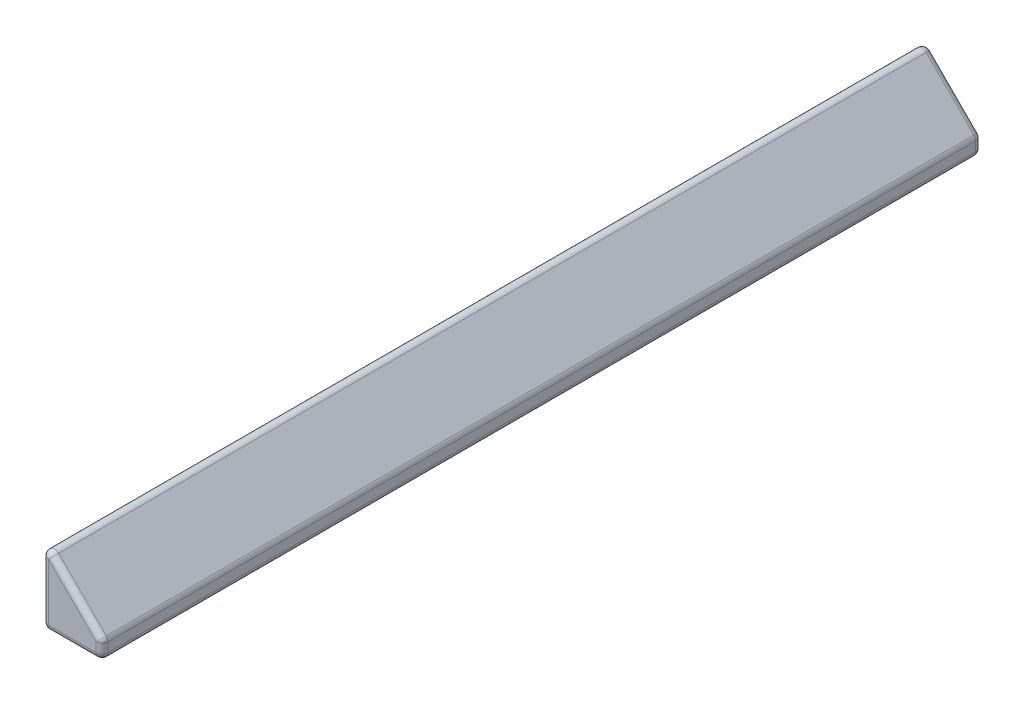
ISO-10303-21;
HEADER;
FILE_DESCRIPTION(('STEP AP214'),'2;1');
FILE_NAME('part.step','',(''),(''),'','','');
FILE_SCHEMA(('AUTOMOTIVE_DESIGN { 1 0 10303 214 1 1 1 1 }'));
ENDSEC;
DATA;
#1=APPLICATION_CONTEXT('core data for automotive mechanical design processes');
#2=APPLICATION_PROTOCOL_DEFINITION('international standard','automotive_design',2000,#1);
#3=PRODUCT_CONTEXT('',#1,'mechanical');
#4=PRODUCT('Part','Part','',(#3));
#5=PRODUCT_RELATED_PRODUCT_CATEGORY('part','',(#4));
#6=PRODUCT_DEFINITION_FORMATION('','',#4);
#7=PRODUCT_DEFINITION_CONTEXT('part definition',#1,'design');
#8=PRODUCT_DEFINITION('design','',#6,#7);
#9=PRODUCT_DEFINITION_SHAPE('','',#8);
#10=(LENGTH_UNIT() NAMED_UNIT(*) SI_UNIT(.MILLI.,.METRE.));
#11=(NAMED_UNIT(*) PLANE_ANGLE_UNIT() SI_UNIT($,.RADIAN.));
#12=(NAMED_UNIT(*) SI_UNIT($,.STERADIAN.) SOLID_ANGLE_UNIT());
#13=UNCERTAINTY_MEASURE_WITH_UNIT(LENGTH_MEASURE(1.E-05),#10,'distance_accuracy_value','');
#14=(GEOMETRIC_REPRESENTATION_CONTEXT(3) GLOBAL_UNCERTAINTY_ASSIGNED_CONTEXT((#13)) GLOBAL_UNIT_ASSIGNED_CONTEXT((#10,
#11,#12)) REPRESENTATION_CONTEXT('',''));
#15=CARTESIAN_POINT('',(0.,0.,0.));
#16=DIRECTION('',(0.,0.,1.));
#17=DIRECTION('',(1.,0.,0.));
#18=AXIS2_PLACEMENT_3D('',#15,#16,#17);
#19=CARTESIAN_POINT('',(224.999999999994,-3.00000000001998,-13.1842131029184));
#20=DIRECTION('',(0.,0.,-1.));
#21=DIRECTION('',(-1.,0.,0.));
#22=AXIS2_PLACEMENT_3D('',#19,#20,#21);
#23=PLANE('',#22);
#24=DIRECTION('',(-0.707106781186546,0.707106781186549,0.));
#25=VECTOR('',#24,1.);
#26=CARTESIAN_POINT('',(225.158578643756,-2.8414213562579,-13.1842131029184));
#27=LINE('',#26,#25);
#28=CARTESIAN_POINT('',(220.199999999993,2.1171572875046,-13.1842131029184));
#29=VERTEX_POINT('',#28);
#30=CARTESIAN_POINT('',(221.799999999993,0.517157287504608,-13.1842131029184));
#31=VERTEX_POINT('',#30);
#32=EDGE_CURVE('E263',#29,#31,#27,.F.);
#33=ORIENTED_EDGE('',*,*,#32,.T.);
#34=DIRECTION('',(0.,1.,0.));
#35=VECTOR('',#34,1.);
#36=CARTESIAN_POINT('',(221.799999999993,-3.00000000001998,-13.1842131029184));
#37=LINE('',#36,#35);
#38=CARTESIAN_POINT('',(221.799999999993,0.199999999979239,-13.1842131029184));
#39=VERTEX_POINT('',#38);
#40=EDGE_CURVE('E261',#31,#39,#37,.F.);
#41=ORIENTED_EDGE('',*,*,#40,.T.);
#42=DIRECTION('',(1.,0.,0.));
#43=VECTOR('',#42,1.);
#44=CARTESIAN_POINT('',(224.999999999994,0.199999999979265,-13.1842131029184));
#45=LINE('',#44,#43);
#46=CARTESIAN_POINT('',(220.199999999993,0.199999999979227,-13.1842131029184));
#47=VERTEX_POINT('',#46);
#48=EDGE_CURVE('E253',#39,#47,#45,.F.);
#49=ORIENTED_EDGE('',*,*,#48,.T.);
#50=DIRECTION('',(0.,-1.,0.));
#51=VECTOR('',#50,1.);
#52=CARTESIAN_POINT('',(220.199999999993,-3.00000000001998,-13.1842131029184));
#53=LINE('',#52,#51);
#54=EDGE_CURVE('E258',#47,#29,#53,.F.);
#55=ORIENTED_EDGE('',*,*,#54,.T.);
#56=EDGE_LOOP('',(#33,#41,#49,#55));
#57=FACE_BOUND('',#56,.T.);
#58=ADVANCED_FACE('F35',(#57),#23,.T.);
#59=CARTESIAN_POINT('',(221.999999999993,0.,-16.4644569962897));
#60=DIRECTION('',(1.,0.,0.));
#61=DIRECTION('',(0.,0.,-1.));
#62=AXIS2_PLACEMENT_3D('',#59,#60,#61);
#63=PLANE('',#62);
#64=DIRECTION('',(0.,0.,1.));
#65=VECTOR('',#64,1.);
#66=CARTESIAN_POINT('',(221.999999999993,0.199999999979239,-16.4644569962897));
#67=LINE('',#66,#65);
#68=CARTESIAN_POINT('',(221.999999999993,0.199999999979239,16.1157868970816));
#69=VERTEX_POINT('',#68);
#70=CARTESIAN_POINT('',(221.999999999993,0.199999999979239,-12.9842131029184));
#71=VERTEX_POINT('',#70);
#72=EDGE_CURVE('E133',#69,#71,#67,.F.);
#73=ORIENTED_EDGE('',*,*,#72,.T.);
#74=DIRECTION('',(0.,1.,0.));
#75=VECTOR('',#74,1.);
#76=CARTESIAN_POINT('',(221.999999999993,0.,-12.9842131029184));
#77=LINE('',#76,#75);
#78=CARTESIAN_POINT('',(221.999999999993,0.51715728750461,-12.9842131029184));
#79=VERTEX_POINT('',#78);
#80=EDGE_CURVE('E129',#71,#79,#77,.T.);
#81=ORIENTED_EDGE('',*,*,#80,.T.);
#82=DIRECTION('',(0.,0.,1.));
#83=VECTOR('',#82,1.);
#84=CARTESIAN_POINT('',(221.999999999993,0.51715728750461,-16.4644569962897));
#85=LINE('',#84,#83);
#86=CARTESIAN_POINT('',(221.999999999993,0.51715728750461,16.1157868970816));
#87=VERTEX_POINT('',#86);
#88=EDGE_CURVE('E123',#79,#87,#85,.T.);
#89=ORIENTED_EDGE('',*,*,#88,.T.);
#90=DIRECTION('',(0.,1.,0.));
#91=VECTOR('',#90,1.);
#92=CARTESIAN_POINT('',(221.999999999993,0.,16.1157868970816));
#93=LINE('',#92,#91);
#94=EDGE_CURVE('E126',#87,#69,#93,.F.);
#95=ORIENTED_EDGE('',*,*,#94,.T.);
#96=EDGE_LOOP('',(#73,#81,#89,#95));
#97=FACE_BOUND('',#96,.T.);
#98=ADVANCED_FACE('F125',(#97),#63,.T.);
#99=CARTESIAN_POINT('',(111.299999999987,111.299999999986,-16.4644569962897));
#100=DIRECTION('',(0.707106781186549,0.707106781186546,0.));
#101=DIRECTION('',(-0.707106781186546,0.707106781186549,0.));
#102=AXIS2_PLACEMENT_3D('',#99,#100,#101);
#103=PLANE('',#102);
#104=DIRECTION('',(0.,0.,1.));
#105=VECTOR('',#104,1.);
#106=CARTESIAN_POINT('',(221.941421356231,0.658578643741928,-16.4644569962897));
#107=LINE('',#106,#105);
#108=CARTESIAN_POINT('',(221.941421356231,0.658578643741911,16.1157868970816));
#109=VERTEX_POINT('',#108);
#110=CARTESIAN_POINT('',(221.941421356231,0.658578643741915,-12.9842131029184));
#111=VERTEX_POINT('',#110);
#112=EDGE_CURVE('E154',#109,#111,#107,.F.);
#113=ORIENTED_EDGE('',*,*,#112,.T.);
#114=DIRECTION('',(-0.707106781186546,0.707106781186549,0.));
#115=VECTOR('',#114,1.);
#116=CARTESIAN_POINT('',(111.299999999987,111.299999999986,-12.9842131029183));
#117=LINE('',#116,#115);
#118=CARTESIAN_POINT('',(220.341421356231,2.25857864374191,-12.9842131029184));
#119=VERTEX_POINT('',#118);
#120=EDGE_CURVE('E276',#111,#119,#117,.T.);
#121=ORIENTED_EDGE('',*,*,#120,.T.);
#122=DIRECTION('',(0.,0.,1.));
#123=VECTOR('',#122,1.);
#124=CARTESIAN_POINT('',(220.341421356231,2.2585786437419,-16.4644569962897));
#125=LINE('',#124,#123);
#126=CARTESIAN_POINT('',(220.341421356231,2.25857864374191,16.1157868970816));
#127=VERTEX_POINT('',#126);
#128=EDGE_CURVE('E269',#119,#127,#125,.T.);
#129=ORIENTED_EDGE('',*,*,#128,.T.);
#130=DIRECTION('',(-0.707106781186546,0.707106781186549,0.));
#131=VECTOR('',#130,1.);
#132=CARTESIAN_POINT('',(111.299999999987,111.299999999986,16.1157868970817));
#133=LINE('',#132,#131);
#134=EDGE_CURVE('E267',#127,#109,#133,.F.);
#135=ORIENTED_EDGE('',*,*,#134,.T.);
#136=EDGE_LOOP('',(#113,#121,#129,#135));
#137=FACE_BOUND('',#136,.T.);
#138=ADVANCED_FACE('F336',(#137),#103,.T.);
#139=CARTESIAN_POINT('',(219.999999999993,0.,-16.4644569962897));
#140=DIRECTION('',(-1.,0.,0.));
#141=DIRECTION('',(0.,0.,1.));
#142=AXIS2_PLACEMENT_3D('',#139,#140,#141);
#143=PLANE('',#142);
#144=DIRECTION('',(0.,0.,1.));
#145=VECTOR('',#144,1.);
#146=CARTESIAN_POINT('',(219.999999999993,2.1171572875046,-16.4644569962897));
#147=LINE('',#146,#145);
#148=CARTESIAN_POINT('',(219.999999999993,2.1171572875046,16.1157868970816));
#149=VERTEX_POINT('',#148);
#150=CARTESIAN_POINT('',(219.999999999993,2.1171572875046,-12.9842131029184));
#151=VERTEX_POINT('',#150);
#152=EDGE_CURVE('E282',#149,#151,#147,.F.);
#153=ORIENTED_EDGE('',*,*,#152,.T.);
#154=DIRECTION('',(0.,-1.,0.));
#155=VECTOR('',#154,1.);
#156=CARTESIAN_POINT('',(219.999999999993,0.,-12.9842131029184));
#157=LINE('',#156,#155);
#158=CARTESIAN_POINT('',(219.999999999993,0.199999999979227,-12.9842131029184));
#159=VERTEX_POINT('',#158);
#160=EDGE_CURVE('E222',#151,#159,#157,.T.);
#161=ORIENTED_EDGE('',*,*,#160,.T.);
#162=DIRECTION('',(0.,0.,1.));
#163=VECTOR('',#162,1.);
#164=CARTESIAN_POINT('',(219.999999999993,0.199999999979227,-16.4644569962897));
#165=LINE('',#164,#163);
#166=CARTESIAN_POINT('',(219.999999999993,0.199999999979227,16.1157868970816));
#167=VERTEX_POINT('',#166);
#168=EDGE_CURVE('E212',#159,#167,#165,.T.);
#169=ORIENTED_EDGE('',*,*,#168,.T.);
#170=DIRECTION('',(0.,-1.,0.));
#171=VECTOR('',#170,1.);
#172=CARTESIAN_POINT('',(219.999999999993,0.,16.1157868970816));
#173=LINE('',#172,#171);
#174=EDGE_CURVE('E279',#167,#149,#173,.F.);
#175=ORIENTED_EDGE('',*,*,#174,.T.);
#176=EDGE_LOOP('',(#153,#161,#169,#175));
#177=FACE_BOUND('',#176,.T.);
#178=ADVANCED_FACE('F285',(#177),#143,.T.);
#179=CARTESIAN_POINT('',(0.,-2.25364598777516E-11,-16.4644569962897));
#180=DIRECTION('',(0.,-1.,0.));
#181=DIRECTION('',(1.,0.,0.));
#182=AXIS2_PLACEMENT_3D('',#179,#180,#181);
#183=PLANE('',#182);
#184=DIRECTION('',(1.,0.,0.));
#185=VECTOR('',#184,1.);
#186=CARTESIAN_POINT('',(0.,-2.25364598777516E-11,-12.9842131029183));
#187=LINE('',#186,#185);
#188=CARTESIAN_POINT('',(220.199999999993,-2.07734470650896E-11,-12.9842131029184));
#189=VERTEX_POINT('',#188);
#190=CARTESIAN_POINT('',(221.799999999993,-2.07606367994209E-11,-12.9842131029184));
#191=VERTEX_POINT('',#190);
#192=EDGE_CURVE('E217',#189,#191,#187,.T.);
#193=ORIENTED_EDGE('',*,*,#192,.T.);
#194=DIRECTION('',(0.,0.,1.));
#195=VECTOR('',#194,1.);
#196=CARTESIAN_POINT('',(221.799999999993,-2.07606367994209E-11,-16.4644569962897));
#197=LINE('',#196,#195);
#198=CARTESIAN_POINT('',(221.799999999993,-2.07606367994209E-11,16.1157868970816));
#199=VERTEX_POINT('',#198);
#200=EDGE_CURVE('E220',#191,#199,#197,.T.);
#201=ORIENTED_EDGE('',*,*,#200,.T.);
#202=DIRECTION('',(1.,0.,0.));
#203=VECTOR('',#202,1.);
#204=CARTESIAN_POINT('',(0.,-2.25364598777516E-11,16.1157868970817));
#205=LINE('',#204,#203);
#206=CARTESIAN_POINT('',(220.199999999993,-2.07734470650896E-11,16.1157868970816));
#207=VERTEX_POINT('',#206);
#208=EDGE_CURVE('E218',#199,#207,#205,.F.);
#209=ORIENTED_EDGE('',*,*,#208,.T.);
#210=DIRECTION('',(0.,0.,1.));
#211=VECTOR('',#210,1.);
#212=CARTESIAN_POINT('',(220.199999999993,-2.07734470650896E-11,-16.4644569962897));
#213=LINE('',#212,#211);
#214=EDGE_CURVE('E214',#207,#189,#213,.F.);
#215=ORIENTED_EDGE('',*,*,#214,.T.);
#216=EDGE_LOOP('',(#193,#201,#209,#215));
#217=FACE_BOUND('',#216,.T.);
#218=ADVANCED_FACE('F309',(#217),#183,.T.);
#219=CARTESIAN_POINT('',(19.9999999999956,-221.888099265377,16.3157868970817));
#220=DIRECTION('',(0.,0.,1.));
#221=DIRECTION('',(1.,0.,0.));
#222=AXIS2_PLACEMENT_3D('',#219,#220,#221);
#223=PLANE('',#222);
#224=DIRECTION('',(0.,-1.,0.));
#225=VECTOR('',#224,1.);
#226=CARTESIAN_POINT('',(220.199999999993,-221.888099265377,16.3157868970816));
#227=LINE('',#226,#225);
#228=CARTESIAN_POINT('',(220.199999999993,2.11715728750464,16.3157868970816));
#229=VERTEX_POINT('',#228);
#230=CARTESIAN_POINT('',(220.199999999993,0.199999999979238,16.3157868970816));
#231=VERTEX_POINT('',#230);
#232=EDGE_CURVE('E44',#229,#231,#227,.T.);
#233=ORIENTED_EDGE('',*,*,#232,.T.);
#234=DIRECTION('',(1.,0.,0.));
#235=VECTOR('',#234,1.);
#236=CARTESIAN_POINT('',(19.9999999999939,0.199999999977635,16.3157868970817));
#237=LINE('',#236,#235);
#238=CARTESIAN_POINT('',(221.799999999993,0.19999999997925,16.3157868970816));
#239=VERTEX_POINT('',#238);
#240=EDGE_CURVE('E11',#231,#239,#237,.T.);
#241=ORIENTED_EDGE('',*,*,#240,.T.);
#242=DIRECTION('',(0.,1.,0.));
#243=VECTOR('',#242,1.);
#244=CARTESIAN_POINT('',(221.799999999993,-221.888099265377,16.3157868970816));
#245=LINE('',#244,#243);
#246=CARTESIAN_POINT('',(221.799999999993,0.517157287504645,16.3157868970816));
#247=VERTEX_POINT('',#246);
#248=EDGE_CURVE('E228',#239,#247,#245,.T.);
#249=ORIENTED_EDGE('',*,*,#248,.T.);
#250=DIRECTION('',(-0.707106781186546,0.707106781186549,0.));
#251=VECTOR('',#250,1.);
#252=CARTESIAN_POINT('',(232.102628276436,-9.78547098893759,16.3157868970816));
#253=LINE('',#252,#251);
#254=EDGE_CURVE('E55',#247,#229,#253,.T.);
#255=ORIENTED_EDGE('',*,*,#254,.T.);
#256=EDGE_LOOP('',(#233,#241,#249,#255));
#257=FACE_BOUND('',#256,.T.);
#258=ADVANCED_FACE('F319',(#257),#223,.T.);
#259=CARTESIAN_POINT('',(220.199999999993,-221.888099265377,16.1157868970816));
#260=DIRECTION('',(0.,-1.,0.));
#261=DIRECTION('',(0.,0.,-1.));
#262=AXIS2_PLACEMENT_3D('',#259,#260,#261);
#263=CYLINDRICAL_SURFACE('',#262,0.2);
#264=CARTESIAN_POINT('',(220.199999999993,0.199999999979238,16.1157868970816));
#265=DIRECTION('',(0.,-1.,0.));
#266=DIRECTION('',(1.,0.,0.));
#267=AXIS2_PLACEMENT_3D('',#264,#265,#266);
#268=CIRCLE('',#267,0.2);
#269=EDGE_CURVE('E39',#231,#167,#268,.T.);
#270=ORIENTED_EDGE('',*,*,#269,.F.);
#271=ORIENTED_EDGE('',*,*,#232,.F.);
#272=CARTESIAN_POINT('',(220.199999999993,2.1171572875046,16.1157868970816));
#273=DIRECTION('',(0.,1.,-2.10335221462189E-13));
#274=DIRECTION('',(0.,2.10335221462189E-13,1.));
#275=AXIS2_PLACEMENT_3D('',#272,#273,#274);
#276=CIRCLE('',#275,0.2);
#277=EDGE_CURVE('E193',#149,#229,#276,.T.);
#278=ORIENTED_EDGE('',*,*,#277,.F.);
#279=ORIENTED_EDGE('',*,*,#174,.F.);
#280=EDGE_LOOP('',(#270,#271,#278,#279));
#281=FACE_BOUND('',#280,.T.);
#282=ADVANCED_FACE('F37',(#281),#263,.T.);
#283=CARTESIAN_POINT('',(220.199999999993,0.199999999979227,16.1157868970816));
#284=DIRECTION('',(0.,0.,1.));
#285=DIRECTION('',(1.,0.,0.));
#286=AXIS2_PLACEMENT_3D('',#283,#284,#285);
#287=SPHERICAL_SURFACE('',#286,0.2);
#288=CARTESIAN_POINT('',(220.199999999993,0.199999999979227,16.1157868970816));
#289=DIRECTION('',(-1.,0.,0.));
#290=DIRECTION('',(0.,0.,1.));
#291=AXIS2_PLACEMENT_3D('',#288,#289,#290);
#292=CIRCLE('',#291,0.2);
#293=EDGE_CURVE('E188',#231,#207,#292,.F.);
#294=ORIENTED_EDGE('',*,*,#293,.F.);
#295=ORIENTED_EDGE('',*,*,#269,.T.);
#296=CARTESIAN_POINT('',(220.199999999993,0.199999999979227,16.1157868970816));
#297=DIRECTION('',(0.,0.,1.));
#298=DIRECTION('',(1.,0.,0.));
#299=AXIS2_PLACEMENT_3D('',#296,#297,#298);
#300=CIRCLE('',#299,0.2);
#301=EDGE_CURVE('E191',#207,#167,#300,.F.);
#302=ORIENTED_EDGE('',*,*,#301,.F.);
#303=EDGE_LOOP('',(#294,#295,#302));
#304=FACE_BOUND('',#303,.T.);
#305=ADVANCED_FACE('F203',(#304),#287,.T.);
#306=CARTESIAN_POINT('',(220.199999999993,2.1171572875046,16.1157868970816));
#307=DIRECTION('',(0.,0.,1.));
#308=DIRECTION('',(1.,0.,0.));
#309=AXIS2_PLACEMENT_3D('',#306,#307,#308);
#310=SPHERICAL_SURFACE('',#309,0.2);
#311=CARTESIAN_POINT('',(220.199999999993,2.1171572875046,16.1157868970816));
#312=DIRECTION('',(0.,0.,1.));
#313=DIRECTION('',(1.,0.,0.));
#314=AXIS2_PLACEMENT_3D('',#311,#312,#313);
#315=CIRCLE('',#314,0.2);
#316=EDGE_CURVE('E182',#149,#127,#315,.F.);
#317=ORIENTED_EDGE('',*,*,#316,.F.);
#318=ORIENTED_EDGE('',*,*,#277,.T.);
#319=CARTESIAN_POINT('',(220.199999999993,2.11715728750464,16.1157868970816));
#320=DIRECTION('',(-0.70710678118642,0.707106781186675,0.));
#321=DIRECTION('',(-0.707106781186675,-0.70710678118642,0.));
#322=AXIS2_PLACEMENT_3D('',#319,#320,#321);
#323=CIRCLE('',#322,0.2);
#324=EDGE_CURVE('E185',#127,#229,#323,.F.);
#325=ORIENTED_EDGE('',*,*,#324,.F.);
#326=EDGE_LOOP('',(#317,#318,#325));
#327=FACE_BOUND('',#326,.T.);
#328=ADVANCED_FACE('F323',(#327),#310,.T.);
#329=CARTESIAN_POINT('',(220.199999999993,0.199999999979227,-16.4644569962897));
#330=DIRECTION('',(0.,0.,1.));
#331=DIRECTION('',(1.,0.,0.));
#332=AXIS2_PLACEMENT_3D('',#329,#330,#331);
#333=CYLINDRICAL_SURFACE('',#332,0.2);
#334=ORIENTED_EDGE('',*,*,#301,.T.);
#335=ORIENTED_EDGE('',*,*,#168,.F.);
#336=CARTESIAN_POINT('',(220.199999999993,0.199999999979227,-12.9842131029184));
#337=DIRECTION('',(0.,0.,-1.));
#338=DIRECTION('',(-1.,0.,0.));
#339=AXIS2_PLACEMENT_3D('',#336,#337,#338);
#340=CIRCLE('',#339,0.2);
#341=EDGE_CURVE('E177',#189,#159,#340,.T.);
#342=ORIENTED_EDGE('',*,*,#341,.F.);
#343=ORIENTED_EDGE('',*,*,#214,.F.);
#344=EDGE_LOOP('',(#334,#335,#342,#343));
#345=FACE_BOUND('',#344,.T.);
#346=ADVANCED_FACE('F210',(#345),#333,.T.);
#347=CARTESIAN_POINT('',(19.9999999999939,0.199999999977635,16.1157868970817));
#348=DIRECTION('',(1.,0.,0.));
#349=DIRECTION('',(0.,1.,0.));
#350=AXIS2_PLACEMENT_3D('',#347,#348,#349);
#351=CYLINDRICAL_SURFACE('',#350,0.2);
#352=ORIENTED_EDGE('',*,*,#293,.T.);
#353=ORIENTED_EDGE('',*,*,#208,.F.);
#354=CARTESIAN_POINT('',(221.799999999993,0.19999999997925,16.1157868970816));
#355=DIRECTION('',(1.,0.,0.));
#356=DIRECTION('',(0.,0.,-1.));
#357=AXIS2_PLACEMENT_3D('',#354,#355,#356);
#358=CIRCLE('',#357,0.2);
#359=EDGE_CURVE('E174',#239,#199,#358,.T.);
#360=ORIENTED_EDGE('',*,*,#359,.F.);
#361=ORIENTED_EDGE('',*,*,#240,.F.);
#362=EDGE_LOOP('',(#352,#353,#360,#361));
#363=FACE_BOUND('',#362,.T.);
#364=ADVANCED_FACE('F318',(#363),#351,.T.);
#365=CARTESIAN_POINT('',(221.799999999993,-221.888099265377,16.1157868970816));
#366=DIRECTION('',(0.,1.,0.));
#367=DIRECTION('',(0.,0.,1.));
#368=AXIS2_PLACEMENT_3D('',#365,#366,#367);
#369=CYLINDRICAL_SURFACE('',#368,0.2);
#370=CARTESIAN_POINT('',(221.799999999993,0.517157287504645,16.1157868970816));
#371=DIRECTION('',(1.72930246511433E-13,1.,0.));
#372=DIRECTION('',(-1.,1.72930246511433E-13,0.));
#373=AXIS2_PLACEMENT_3D('',#370,#371,#372);
#374=CIRCLE('',#373,0.2);
#375=EDGE_CURVE('E140',#247,#87,#374,.T.);
#376=ORIENTED_EDGE('',*,*,#375,.F.);
#377=ORIENTED_EDGE('',*,*,#248,.F.);
#378=CARTESIAN_POINT('',(221.799999999993,0.199999999979239,16.1157868970816));
#379=DIRECTION('',(0.,-1.,0.));
#380=DIRECTION('',(0.,0.,-1.));
#381=AXIS2_PLACEMENT_3D('',#378,#379,#380);
#382=CIRCLE('',#381,0.2);
#383=EDGE_CURVE('E142',#69,#239,#382,.T.);
#384=ORIENTED_EDGE('',*,*,#383,.F.);
#385=ORIENTED_EDGE('',*,*,#94,.F.);
#386=EDGE_LOOP('',(#376,#377,#384,#385));
#387=FACE_BOUND('',#386,.T.);
#388=ADVANCED_FACE('F138',(#387),#369,.T.);
#389=CARTESIAN_POINT('',(232.102628276436,-9.78547098893756,16.1157868970816));
#390=DIRECTION('',(-0.707106781186546,0.707106781186549,0.));
#391=DIRECTION('',(-0.707106781186549,-0.707106781186546,0.));
#392=AXIS2_PLACEMENT_3D('',#389,#390,#391);
#393=CYLINDRICAL_SURFACE('',#392,0.2);
#394=ORIENTED_EDGE('',*,*,#324,.T.);
#395=ORIENTED_EDGE('',*,*,#254,.F.);
#396=CARTESIAN_POINT('',(221.799999999993,0.517157287504602,16.1157868970816));
#397=DIRECTION('',(0.70710678118652,-0.707106781186575,0.));
#398=DIRECTION('',(0.707106781186575,0.70710678118652,0.));
#399=AXIS2_PLACEMENT_3D('',#396,#397,#398);
#400=CIRCLE('',#399,0.2);
#401=EDGE_CURVE('E151',#109,#247,#400,.T.);
#402=ORIENTED_EDGE('',*,*,#401,.F.);
#403=ORIENTED_EDGE('',*,*,#134,.F.);
#404=EDGE_LOOP('',(#394,#395,#402,#403));
#405=FACE_BOUND('',#404,.T.);
#406=ADVANCED_FACE('F321',(#405),#393,.T.);
#407=CARTESIAN_POINT('',(220.199999999993,2.1171572875046,-16.4644569962897));
#408=DIRECTION('',(0.,0.,1.));
#409=DIRECTION('',(1.,0.,0.));
#410=AXIS2_PLACEMENT_3D('',#407,#408,#409);
#411=CYLINDRICAL_SURFACE('',#410,0.2);
#412=ORIENTED_EDGE('',*,*,#316,.T.);
#413=ORIENTED_EDGE('',*,*,#128,.F.);
#414=CARTESIAN_POINT('',(220.199999999993,2.1171572875046,-12.9842131029184));
#415=DIRECTION('',(0.,0.,-1.));
#416=DIRECTION('',(-1.,0.,0.));
#417=AXIS2_PLACEMENT_3D('',#414,#415,#416);
#418=CIRCLE('',#417,0.2);
#419=EDGE_CURVE('E169',#151,#119,#418,.T.);
#420=ORIENTED_EDGE('',*,*,#419,.F.);
#421=ORIENTED_EDGE('',*,*,#152,.F.);
#422=EDGE_LOOP('',(#412,#413,#420,#421));
#423=FACE_BOUND('',#422,.T.);
#424=ADVANCED_FACE('F295',(#423),#411,.T.);
#425=CARTESIAN_POINT('',(220.199999999993,0.,-12.9842131029184));
#426=DIRECTION('',(0.,-1.,0.));
#427=DIRECTION('',(0.,0.,-1.));
#428=AXIS2_PLACEMENT_3D('',#425,#426,#427);
#429=CYLINDRICAL_SURFACE('',#428,0.2);
#430=CARTESIAN_POINT('',(220.199999999993,0.199999999979227,-12.9842131029184));
#431=DIRECTION('',(0.,-1.,0.));
#432=DIRECTION('',(0.,0.,-1.));
#433=AXIS2_PLACEMENT_3D('',#430,#431,#432);
#434=CIRCLE('',#433,0.2);
#435=EDGE_CURVE('E179',#159,#47,#434,.T.);
#436=ORIENTED_EDGE('',*,*,#435,.F.);
#437=ORIENTED_EDGE('',*,*,#160,.F.);
#438=CARTESIAN_POINT('',(220.199999999993,2.1171572875046,-12.9842131029184));
#439=DIRECTION('',(0.,1.,0.));
#440=DIRECTION('',(-1.,0.,0.));
#441=AXIS2_PLACEMENT_3D('',#438,#439,#440);
#442=CIRCLE('',#441,0.2);
#443=EDGE_CURVE('E166',#29,#151,#442,.T.);
#444=ORIENTED_EDGE('',*,*,#443,.F.);
#445=ORIENTED_EDGE('',*,*,#54,.F.);
#446=EDGE_LOOP('',(#436,#437,#444,#445));
#447=FACE_BOUND('',#446,.T.);
#448=ADVANCED_FACE('F291',(#447),#429,.T.);
#449=CARTESIAN_POINT('',(220.199999999993,0.199999999979227,-12.9842131029184));
#450=DIRECTION('',(0.,0.,1.));
#451=DIRECTION('',(1.,0.,0.));
#452=AXIS2_PLACEMENT_3D('',#449,#450,#451);
#453=SPHERICAL_SURFACE('',#452,0.2);
#454=ORIENTED_EDGE('',*,*,#341,.T.);
#455=ORIENTED_EDGE('',*,*,#435,.T.);
#456=CARTESIAN_POINT('',(220.199999999993,0.199999999979227,-12.9842131029184));
#457=DIRECTION('',(-1.,0.,0.));
#458=DIRECTION('',(0.,0.,1.));
#459=AXIS2_PLACEMENT_3D('',#456,#457,#458);
#460=CIRCLE('',#459,0.2);
#461=EDGE_CURVE('E158',#189,#47,#460,.F.);
#462=ORIENTED_EDGE('',*,*,#461,.F.);
#463=EDGE_LOOP('',(#454,#455,#462));
#464=FACE_BOUND('',#463,.T.);
#465=ADVANCED_FACE('F307',(#464),#453,.T.);
#466=CARTESIAN_POINT('',(221.799999999993,0.199999999979239,16.1157868970816));
#467=DIRECTION('',(0.,0.,1.));
#468=DIRECTION('',(1.,0.,0.));
#469=AXIS2_PLACEMENT_3D('',#466,#467,#468);
#470=SPHERICAL_SURFACE('',#469,0.2);
#471=ORIENTED_EDGE('',*,*,#383,.T.);
#472=ORIENTED_EDGE('',*,*,#359,.T.);
#473=CARTESIAN_POINT('',(221.799999999993,0.199999999979239,16.1157868970816));
#474=DIRECTION('',(0.,0.,1.));
#475=DIRECTION('',(1.,0.,0.));
#476=AXIS2_PLACEMENT_3D('',#473,#474,#475);
#477=CIRCLE('',#476,0.2);
#478=EDGE_CURVE('E155',#69,#199,#477,.F.);
#479=ORIENTED_EDGE('',*,*,#478,.F.);
#480=EDGE_LOOP('',(#471,#472,#479));
#481=FACE_BOUND('',#480,.T.);
#482=ADVANCED_FACE('F316',(#481),#470,.T.);
#483=CARTESIAN_POINT('',(221.799999999993,0.517157287504619,16.1157868970816));
#484=DIRECTION('',(0.,0.,1.));
#485=DIRECTION('',(1.,0.,0.));
#486=AXIS2_PLACEMENT_3D('',#483,#484,#485);
#487=SPHERICAL_SURFACE('',#486,0.2);
#488=ORIENTED_EDGE('',*,*,#401,.T.);
#489=ORIENTED_EDGE('',*,*,#375,.T.);
#490=CARTESIAN_POINT('',(221.799999999993,0.51715728750461,16.1157868970816));
#491=DIRECTION('',(0.,0.,1.));
#492=DIRECTION('',(1.,0.,0.));
#493=AXIS2_PLACEMENT_3D('',#490,#491,#492);
#494=CIRCLE('',#493,0.2);
#495=EDGE_CURVE('E148',#109,#87,#494,.F.);
#496=ORIENTED_EDGE('',*,*,#495,.F.);
#497=EDGE_LOOP('',(#488,#489,#496));
#498=FACE_BOUND('',#497,.T.);
#499=ADVANCED_FACE('F147',(#498),#487,.T.);
#500=CARTESIAN_POINT('',(220.199999999993,2.11715728750461,-12.9842131029184));
#501=DIRECTION('',(0.,0.,1.));
#502=DIRECTION('',(1.,0.,0.));
#503=AXIS2_PLACEMENT_3D('',#500,#501,#502);
#504=SPHERICAL_SURFACE('',#503,0.2);
#505=ORIENTED_EDGE('',*,*,#443,.T.);
#506=ORIENTED_EDGE('',*,*,#419,.T.);
#507=CARTESIAN_POINT('',(220.199999999993,2.1171572875046,-12.9842131029184));
#508=DIRECTION('',(-0.70710678118652,0.707106781186575,0.));
#509=DIRECTION('',(-0.707106781186575,-0.70710678118652,0.));
#510=AXIS2_PLACEMENT_3D('',#507,#508,#509);
#511=CIRCLE('',#510,0.2);
#512=EDGE_CURVE('E156',#29,#119,#511,.F.);
#513=ORIENTED_EDGE('',*,*,#512,.F.);
#514=EDGE_LOOP('',(#505,#506,#513));
#515=FACE_BOUND('',#514,.T.);
#516=ADVANCED_FACE('F297',(#515),#504,.T.);
#517=CARTESIAN_POINT('',(0.,0.199999999977464,-12.9842131029183));
#518=DIRECTION('',(1.,0.,0.));
#519=DIRECTION('',(0.,1.,0.));
#520=AXIS2_PLACEMENT_3D('',#517,#518,#519);
#521=CYLINDRICAL_SURFACE('',#520,0.2);
#522=ORIENTED_EDGE('',*,*,#461,.T.);
#523=ORIENTED_EDGE('',*,*,#48,.F.);
#524=CARTESIAN_POINT('',(221.799999999993,0.199999999979239,-12.9842131029184));
#525=DIRECTION('',(1.,0.,0.));
#526=DIRECTION('',(0.,0.,-1.));
#527=AXIS2_PLACEMENT_3D('',#524,#525,#526);
#528=CIRCLE('',#527,0.2);
#529=EDGE_CURVE('E160',#191,#39,#528,.T.);
#530=ORIENTED_EDGE('',*,*,#529,.F.);
#531=ORIENTED_EDGE('',*,*,#192,.F.);
#532=EDGE_LOOP('',(#522,#523,#530,#531));
#533=FACE_BOUND('',#532,.T.);
#534=ADVANCED_FACE('F255',(#533),#521,.T.);
#535=CARTESIAN_POINT('',(221.799999999993,0.199999999979239,-16.4644569962897));
#536=DIRECTION('',(0.,0.,1.));
#537=DIRECTION('',(1.,0.,0.));
#538=AXIS2_PLACEMENT_3D('',#535,#536,#537);
#539=CYLINDRICAL_SURFACE('',#538,0.2);
#540=ORIENTED_EDGE('',*,*,#478,.T.);
#541=ORIENTED_EDGE('',*,*,#200,.F.);
#542=CARTESIAN_POINT('',(221.799999999993,0.199999999979239,-12.9842131029184));
#543=DIRECTION('',(0.,0.,-1.));
#544=DIRECTION('',(-1.,0.,0.));
#545=AXIS2_PLACEMENT_3D('',#542,#543,#544);
#546=CIRCLE('',#545,0.2);
#547=EDGE_CURVE('E242',#71,#191,#546,.T.);
#548=ORIENTED_EDGE('',*,*,#547,.F.);
#549=ORIENTED_EDGE('',*,*,#72,.F.);
#550=EDGE_LOOP('',(#540,#541,#548,#549));
#551=FACE_BOUND('',#550,.T.);
#552=ADVANCED_FACE('F311',(#551),#539,.T.);
#553=CARTESIAN_POINT('',(221.799999999993,0.51715728750461,-16.4644569962897));
#554=DIRECTION('',(0.,0.,1.));
#555=DIRECTION('',(1.,0.,0.));
#556=AXIS2_PLACEMENT_3D('',#553,#554,#555);
#557=CYLINDRICAL_SURFACE('',#556,0.2);
#558=ORIENTED_EDGE('',*,*,#495,.T.);
#559=ORIENTED_EDGE('',*,*,#88,.F.);
#560=CARTESIAN_POINT('',(221.799999999993,0.517157287504606,-12.9842131029184));
#561=DIRECTION('',(0.,0.,-1.));
#562=DIRECTION('',(-1.,0.,0.));
#563=AXIS2_PLACEMENT_3D('',#560,#561,#562);
#564=CIRCLE('',#563,0.2);
#565=EDGE_CURVE('E239',#111,#79,#564,.T.);
#566=ORIENTED_EDGE('',*,*,#565,.F.);
#567=ORIENTED_EDGE('',*,*,#112,.F.);
#568=EDGE_LOOP('',(#558,#559,#566,#567));
#569=FACE_BOUND('',#568,.T.);
#570=ADVANCED_FACE('F153',(#569),#557,.T.);
#571=CARTESIAN_POINT('',(111.158578643749,111.158578643749,-12.9842131029183));
#572=DIRECTION('',(-0.707106781186546,0.707106781186549,0.));
#573=DIRECTION('',(-0.707106781186549,-0.707106781186546,0.));
#574=AXIS2_PLACEMENT_3D('',#571,#572,#573);
#575=CYLINDRICAL_SURFACE('',#574,0.2);
#576=ORIENTED_EDGE('',*,*,#512,.T.);
#577=ORIENTED_EDGE('',*,*,#120,.F.);
#578=CARTESIAN_POINT('',(221.799999999993,0.517157287504608,-12.9842131029184));
#579=DIRECTION('',(0.707106781186589,-0.707106781186506,0.));
#580=DIRECTION('',(0.707106781186506,0.707106781186589,0.));
#581=AXIS2_PLACEMENT_3D('',#578,#579,#580);
#582=CIRCLE('',#581,0.2);
#583=EDGE_CURVE('E236',#31,#111,#582,.T.);
#584=ORIENTED_EDGE('',*,*,#583,.F.);
#585=ORIENTED_EDGE('',*,*,#32,.F.);
#586=EDGE_LOOP('',(#576,#577,#584,#585));
#587=FACE_BOUND('',#586,.T.);
#588=ADVANCED_FACE('F300',(#587),#575,.T.);
#589=CARTESIAN_POINT('',(221.799999999993,0.199999999979239,-12.9842131029184));
#590=DIRECTION('',(0.,0.,1.));
#591=DIRECTION('',(1.,0.,0.));
#592=AXIS2_PLACEMENT_3D('',#589,#590,#591);
#593=SPHERICAL_SURFACE('',#592,0.2);
#594=ORIENTED_EDGE('',*,*,#547,.T.);
#595=ORIENTED_EDGE('',*,*,#529,.T.);
#596=CARTESIAN_POINT('',(221.799999999993,0.199999999979239,-12.9842131029184));
#597=DIRECTION('',(0.,-1.,0.));
#598=DIRECTION('',(1.,0.,0.));
#599=AXIS2_PLACEMENT_3D('',#596,#597,#598);
#600=CIRCLE('',#599,0.2);
#601=EDGE_CURVE('E234',#71,#39,#600,.F.);
#602=ORIENTED_EDGE('',*,*,#601,.F.);
#603=EDGE_LOOP('',(#594,#595,#602));
#604=FACE_BOUND('',#603,.T.);
#605=ADVANCED_FACE('F249',(#604),#593,.T.);
#606=CARTESIAN_POINT('',(221.799999999993,0.517157287504608,-12.9842131029184));
#607=DIRECTION('',(0.,0.,1.));
#608=DIRECTION('',(1.,0.,0.));
#609=AXIS2_PLACEMENT_3D('',#606,#607,#608);
#610=SPHERICAL_SURFACE('',#609,0.2);
#611=ORIENTED_EDGE('',*,*,#583,.T.);
#612=ORIENTED_EDGE('',*,*,#565,.T.);
#613=CARTESIAN_POINT('',(221.799999999993,0.51715728750461,-12.9842131029184));
#614=DIRECTION('',(0.,1.,0.));
#615=DIRECTION('',(0.,0.,1.));
#616=AXIS2_PLACEMENT_3D('',#613,#614,#615);
#617=CIRCLE('',#616,0.2);
#618=EDGE_CURVE('E232',#31,#79,#617,.F.);
#619=ORIENTED_EDGE('',*,*,#618,.F.);
#620=EDGE_LOOP('',(#611,#612,#619));
#621=FACE_BOUND('',#620,.T.);
#622=ADVANCED_FACE('F302',(#621),#610,.T.);
#623=CARTESIAN_POINT('',(221.799999999993,0.,-12.9842131029184));
#624=DIRECTION('',(0.,1.,0.));
#625=DIRECTION('',(0.,0.,1.));
#626=AXIS2_PLACEMENT_3D('',#623,#624,#625);
#627=CYLINDRICAL_SURFACE('',#626,0.2);
#628=ORIENTED_EDGE('',*,*,#601,.T.);
#629=ORIENTED_EDGE('',*,*,#40,.F.);
#630=ORIENTED_EDGE('',*,*,#618,.T.);
#631=ORIENTED_EDGE('',*,*,#80,.F.);
#632=EDGE_LOOP('',(#628,#629,#630,#631));
#633=FACE_BOUND('',#632,.T.);
#634=ADVANCED_FACE('F303',(#633),#627,.T.);
#635=CLOSED_SHELL('',(#58,#98,#138,#178,#218,#258,#282,#305,#328,#346,#364,#388,#406,#424,#448,
#465,#482,#499,#516,#534,#552,#570,#588,#605,#622,#634));
#636=MANIFOLD_SOLID_BREP('B2',#635);
#637=ADVANCED_BREP_SHAPE_REPRESENTATION('',(#18,#636),#14);
#638=SHAPE_DEFINITION_REPRESENTATION(#9,#637);
ENDSEC;
END-ISO-10303-21;
